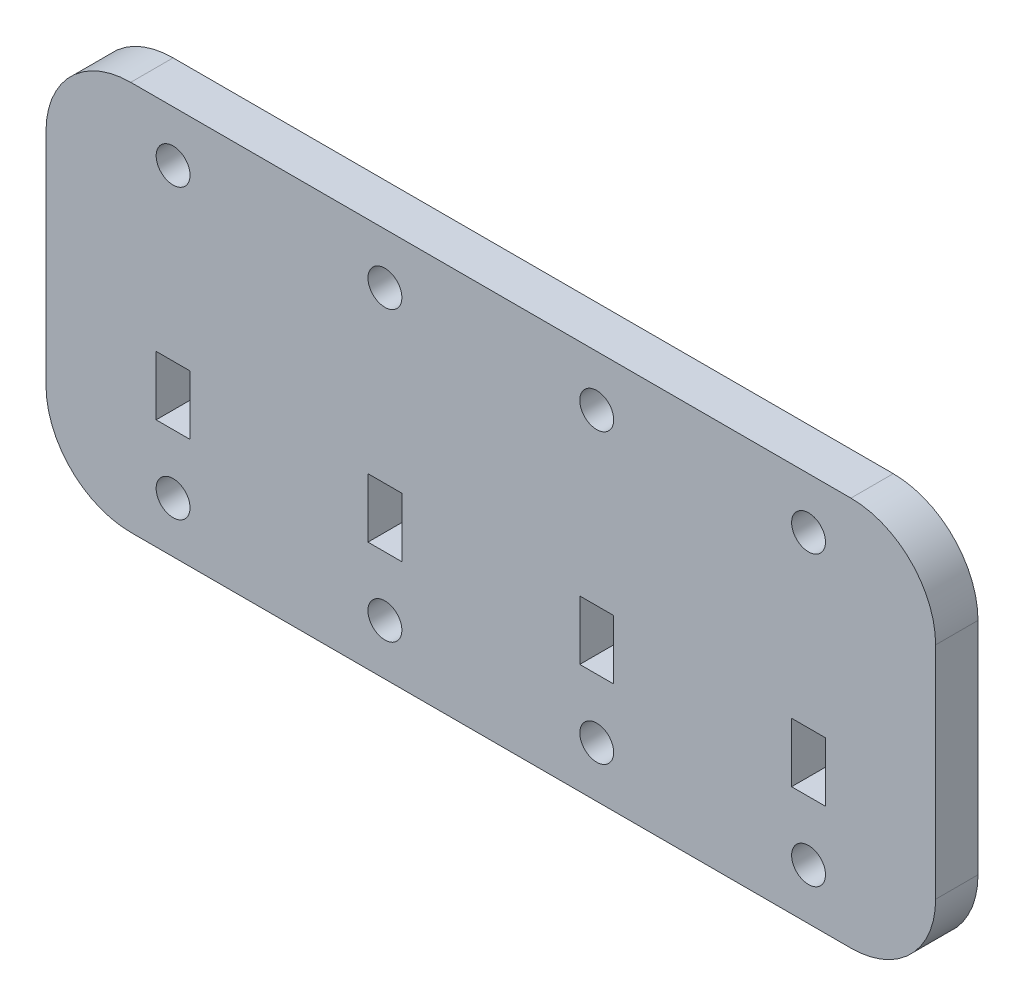
ISO-10303-21;
HEADER;
FILE_DESCRIPTION(('STEP AP214'),'2;1');
FILE_NAME('part.step','',(''),(''),'','','');
FILE_SCHEMA(('AUTOMOTIVE_DESIGN { 1 0 10303 214 1 1 1 1 }'));
ENDSEC;
DATA;
#1=APPLICATION_CONTEXT('core data for automotive mechanical design processes');
#2=APPLICATION_PROTOCOL_DEFINITION('international standard','automotive_design',2000,#1);
#3=PRODUCT_CONTEXT('',#1,'mechanical');
#4=PRODUCT('Part','Part','',(#3));
#5=PRODUCT_RELATED_PRODUCT_CATEGORY('part','',(#4));
#6=PRODUCT_DEFINITION_FORMATION('','',#4);
#7=PRODUCT_DEFINITION_CONTEXT('part definition',#1,'design');
#8=PRODUCT_DEFINITION('design','',#6,#7);
#9=PRODUCT_DEFINITION_SHAPE('','',#8);
#10=(LENGTH_UNIT() NAMED_UNIT(*) SI_UNIT(.MILLI.,.METRE.));
#11=(NAMED_UNIT(*) PLANE_ANGLE_UNIT() SI_UNIT($,.RADIAN.));
#12=(NAMED_UNIT(*) SI_UNIT($,.STERADIAN.) SOLID_ANGLE_UNIT());
#13=UNCERTAINTY_MEASURE_WITH_UNIT(LENGTH_MEASURE(1.E-05),#10,'distance_accuracy_value','');
#14=(GEOMETRIC_REPRESENTATION_CONTEXT(3) GLOBAL_UNCERTAINTY_ASSIGNED_CONTEXT((#13)) GLOBAL_UNIT_ASSIGNED_CONTEXT((#10,
#11,#12)) REPRESENTATION_CONTEXT('',''));
#15=CARTESIAN_POINT('',(0.,0.,0.));
#16=DIRECTION('',(0.,0.,1.));
#17=DIRECTION('',(1.,0.,0.));
#18=AXIS2_PLACEMENT_3D('',#15,#16,#17);
#19=CARTESIAN_POINT('',(0.,0.,5.));
#20=DIRECTION('',(0.,0.,-1.));
#21=DIRECTION('',(-1.,0.,0.));
#22=AXIS2_PLACEMENT_3D('',#19,#20,#21);
#23=PLANE('',#22);
#24=DIRECTION('',(-1.,0.,0.));
#25=VECTOR('',#24,1.);
#26=CARTESIAN_POINT('',(63.,20.,5.));
#27=LINE('',#26,#25);
#28=CARTESIAN_POINT('',(67.,20.,5.));
#29=VERTEX_POINT('',#28);
#30=CARTESIAN_POINT('',(63.,20.,5.));
#31=VERTEX_POINT('',#30);
#32=EDGE_CURVE('E459',#29,#31,#27,.T.);
#33=ORIENTED_EDGE('',*,*,#32,.F.);
#34=DIRECTION('',(0.,1.,0.));
#35=VECTOR('',#34,1.);
#36=CARTESIAN_POINT('',(67.,20.,5.));
#37=LINE('',#36,#35);
#38=CARTESIAN_POINT('',(67.,13.,5.));
#39=VERTEX_POINT('',#38);
#40=EDGE_CURVE('E472',#39,#29,#37,.T.);
#41=ORIENTED_EDGE('',*,*,#40,.F.);
#42=DIRECTION('',(1.,0.,0.));
#43=VECTOR('',#42,1.);
#44=CARTESIAN_POINT('',(63.,13.,5.));
#45=LINE('',#44,#43);
#46=CARTESIAN_POINT('',(63.,13.,5.));
#47=VERTEX_POINT('',#46);
#48=EDGE_CURVE('E477',#47,#39,#45,.T.);
#49=ORIENTED_EDGE('',*,*,#48,.F.);
#50=DIRECTION('',(0.,-1.,0.));
#51=VECTOR('',#50,1.);
#52=CARTESIAN_POINT('',(63.,20.,5.));
#53=LINE('',#52,#51);
#54=EDGE_CURVE('E463',#31,#47,#53,.T.);
#55=ORIENTED_EDGE('',*,*,#54,.F.);
#56=EDGE_LOOP('',(#33,#41,#49,#55));
#57=FACE_BOUND('',#56,.T.);
#58=DIRECTION('',(-1.,0.,0.));
#59=VECTOR('',#58,1.);
#60=CARTESIAN_POINT('',(38.,20.,5.));
#61=LINE('',#60,#59);
#62=CARTESIAN_POINT('',(42.,20.,5.));
#63=VERTEX_POINT('',#62);
#64=CARTESIAN_POINT('',(38.,20.,5.));
#65=VERTEX_POINT('',#64);
#66=EDGE_CURVE('E955',#63,#65,#61,.T.);
#67=ORIENTED_EDGE('',*,*,#66,.F.);
#68=DIRECTION('',(0.,1.,0.));
#69=VECTOR('',#68,1.);
#70=CARTESIAN_POINT('',(42.,20.,5.));
#71=LINE('',#70,#69);
#72=CARTESIAN_POINT('',(42.,13.,5.));
#73=VERTEX_POINT('',#72);
#74=EDGE_CURVE('E964',#73,#63,#71,.T.);
#75=ORIENTED_EDGE('',*,*,#74,.F.);
#76=DIRECTION('',(1.,0.,0.));
#77=VECTOR('',#76,1.);
#78=CARTESIAN_POINT('',(38.,13.,5.));
#79=LINE('',#78,#77);
#80=CARTESIAN_POINT('',(38.,13.,5.));
#81=VERTEX_POINT('',#80);
#82=EDGE_CURVE('E968',#81,#73,#79,.T.);
#83=ORIENTED_EDGE('',*,*,#82,.F.);
#84=DIRECTION('',(0.,-1.,0.));
#85=VECTOR('',#84,1.);
#86=CARTESIAN_POINT('',(38.,20.,5.));
#87=LINE('',#86,#85);
#88=EDGE_CURVE('E957',#65,#81,#87,.T.);
#89=ORIENTED_EDGE('',*,*,#88,.F.);
#90=EDGE_LOOP('',(#67,#75,#83,#89));
#91=FACE_BOUND('',#90,.T.);
#92=DIRECTION('',(0.,-1.,0.));
#93=VECTOR('',#92,1.);
#94=CARTESIAN_POINT('',(0.,0.,5.));
#95=LINE('',#94,#93);
#96=CARTESIAN_POINT('',(0.,36.,5.));
#97=VERTEX_POINT('',#96);
#98=CARTESIAN_POINT('',(0.,10.,5.));
#99=VERTEX_POINT('',#98);
#100=EDGE_CURVE('E345',#97,#99,#95,.T.);
#101=ORIENTED_EDGE('',*,*,#100,.T.);
#102=CARTESIAN_POINT('',(10.,10.,5.));
#103=DIRECTION('',(0.,0.,-1.));
#104=DIRECTION('',(-1.,0.,0.));
#105=AXIS2_PLACEMENT_3D('',#102,#103,#104);
#106=CIRCLE('',#105,10.);
#107=CARTESIAN_POINT('',(10.,0.,5.));
#108=VERTEX_POINT('',#107);
#109=EDGE_CURVE('E403',#99,#108,#106,.F.);
#110=ORIENTED_EDGE('',*,*,#109,.T.);
#111=DIRECTION('',(1.,0.,0.));
#112=VECTOR('',#111,1.);
#113=CARTESIAN_POINT('',(0.,0.,5.));
#114=LINE('',#113,#112);
#115=CARTESIAN_POINT('',(95.,0.,5.));
#116=VERTEX_POINT('',#115);
#117=EDGE_CURVE('E350',#108,#116,#114,.T.);
#118=ORIENTED_EDGE('',*,*,#117,.T.);
#119=CARTESIAN_POINT('',(95.,10.,5.));
#120=DIRECTION('',(0.,0.,-1.));
#121=DIRECTION('',(-1.,0.,0.));
#122=AXIS2_PLACEMENT_3D('',#119,#120,#121);
#123=CIRCLE('',#122,10.);
#124=CARTESIAN_POINT('',(105.,10.,5.));
#125=VERTEX_POINT('',#124);
#126=EDGE_CURVE('E400',#116,#125,#123,.F.);
#127=ORIENTED_EDGE('',*,*,#126,.T.);
#128=DIRECTION('',(0.,1.,0.));
#129=VECTOR('',#128,1.);
#130=CARTESIAN_POINT('',(105.,0.,5.));
#131=LINE('',#130,#129);
#132=CARTESIAN_POINT('',(105.,36.,5.));
#133=VERTEX_POINT('',#132);
#134=EDGE_CURVE('E361',#125,#133,#131,.T.);
#135=ORIENTED_EDGE('',*,*,#134,.T.);
#136=CARTESIAN_POINT('',(95.,36.,5.));
#137=DIRECTION('',(0.,0.,-1.));
#138=DIRECTION('',(-1.,0.,0.));
#139=AXIS2_PLACEMENT_3D('',#136,#137,#138);
#140=CIRCLE('',#139,10.);
#141=CARTESIAN_POINT('',(95.,46.,5.));
#142=VERTEX_POINT('',#141);
#143=EDGE_CURVE('E63',#133,#142,#140,.F.);
#144=ORIENTED_EDGE('',*,*,#143,.T.);
#145=DIRECTION('',(-1.,0.,0.));
#146=VECTOR('',#145,1.);
#147=CARTESIAN_POINT('',(0.,46.,5.));
#148=LINE('',#147,#146);
#149=CARTESIAN_POINT('',(10.,46.,5.));
#150=VERTEX_POINT('',#149);
#151=EDGE_CURVE('E364',#142,#150,#148,.T.);
#152=ORIENTED_EDGE('',*,*,#151,.T.);
#153=CARTESIAN_POINT('',(10.,36.,5.));
#154=DIRECTION('',(0.,0.,-1.));
#155=DIRECTION('',(-1.,0.,0.));
#156=AXIS2_PLACEMENT_3D('',#153,#154,#155);
#157=CIRCLE('',#156,10.);
#158=EDGE_CURVE('E395',#150,#97,#157,.F.);
#159=ORIENTED_EDGE('',*,*,#158,.T.);
#160=EDGE_LOOP('',(#101,#110,#118,#127,#135,#144,#152,#159));
#161=FACE_BOUND('',#160,.T.);
#162=CARTESIAN_POINT('',(15.,5.99999999999999,5.));
#163=DIRECTION('',(0.,0.,1.));
#164=DIRECTION('',(1.,0.,0.));
#165=AXIS2_PLACEMENT_3D('',#162,#163,#164);
#166=CIRCLE('',#165,2.);
#167=CARTESIAN_POINT('',(17.,5.99999999999999,5.));
#168=VERTEX_POINT('',#167);
#169=EDGE_CURVE('E337',#168,#168,#166,.T.);
#170=ORIENTED_EDGE('',*,*,#169,.F.);
#171=EDGE_LOOP('',(#170));
#172=FACE_BOUND('',#171,.T.);
#173=CARTESIAN_POINT('',(15.,40.,5.));
#174=DIRECTION('',(0.,0.,1.));
#175=DIRECTION('',(1.,0.,0.));
#176=AXIS2_PLACEMENT_3D('',#173,#174,#175);
#177=CIRCLE('',#176,2.);
#178=CARTESIAN_POINT('',(17.,40.,5.));
#179=VERTEX_POINT('',#178);
#180=EDGE_CURVE('E326',#179,#179,#177,.T.);
#181=ORIENTED_EDGE('',*,*,#180,.F.);
#182=EDGE_LOOP('',(#181));
#183=FACE_BOUND('',#182,.T.);
#184=DIRECTION('',(0.,-1.,0.));
#185=VECTOR('',#184,1.);
#186=CARTESIAN_POINT('',(13.,20.,5.));
#187=LINE('',#186,#185);
#188=CARTESIAN_POINT('',(13.,20.,5.));
#189=VERTEX_POINT('',#188);
#190=CARTESIAN_POINT('',(13.,13.,5.));
#191=VERTEX_POINT('',#190);
#192=EDGE_CURVE('E308',#189,#191,#187,.T.);
#193=ORIENTED_EDGE('',*,*,#192,.F.);
#194=DIRECTION('',(-1.,0.,0.));
#195=VECTOR('',#194,1.);
#196=CARTESIAN_POINT('',(13.,20.,5.));
#197=LINE('',#196,#195);
#198=CARTESIAN_POINT('',(17.,20.,5.));
#199=VERTEX_POINT('',#198);
#200=EDGE_CURVE('E314',#199,#189,#197,.T.);
#201=ORIENTED_EDGE('',*,*,#200,.F.);
#202=DIRECTION('',(0.,1.,0.));
#203=VECTOR('',#202,1.);
#204=CARTESIAN_POINT('',(17.,20.,5.));
#205=LINE('',#204,#203);
#206=CARTESIAN_POINT('',(17.,13.,5.));
#207=VERTEX_POINT('',#206);
#208=EDGE_CURVE('E307',#207,#199,#205,.T.);
#209=ORIENTED_EDGE('',*,*,#208,.F.);
#210=DIRECTION('',(1.,0.,0.));
#211=VECTOR('',#210,1.);
#212=CARTESIAN_POINT('',(13.,13.,5.));
#213=LINE('',#212,#211);
#214=EDGE_CURVE('E304',#191,#207,#213,.T.);
#215=ORIENTED_EDGE('',*,*,#214,.F.);
#216=EDGE_LOOP('',(#193,#201,#209,#215));
#217=FACE_BOUND('',#216,.T.);
#218=CARTESIAN_POINT('',(40.,5.99999999999999,5.));
#219=DIRECTION('',(0.,0.,1.));
#220=DIRECTION('',(1.,0.,0.));
#221=AXIS2_PLACEMENT_3D('',#218,#219,#220);
#222=CIRCLE('',#221,2.);
#223=CARTESIAN_POINT('',(42.,5.99999999999999,5.));
#224=VERTEX_POINT('',#223);
#225=EDGE_CURVE('E292',#224,#224,#222,.T.);
#226=ORIENTED_EDGE('',*,*,#225,.F.);
#227=EDGE_LOOP('',(#226));
#228=FACE_BOUND('',#227,.T.);
#229=CARTESIAN_POINT('',(40.,40.,5.));
#230=DIRECTION('',(0.,0.,1.));
#231=DIRECTION('',(1.,0.,0.));
#232=AXIS2_PLACEMENT_3D('',#229,#230,#231);
#233=CIRCLE('',#232,2.);
#234=CARTESIAN_POINT('',(42.,40.,5.));
#235=VERTEX_POINT('',#234);
#236=EDGE_CURVE('E284',#235,#235,#233,.T.);
#237=ORIENTED_EDGE('',*,*,#236,.F.);
#238=EDGE_LOOP('',(#237));
#239=FACE_BOUND('',#238,.T.);
#240=CARTESIAN_POINT('',(65.,5.99999999999999,5.));
#241=DIRECTION('',(0.,0.,1.));
#242=DIRECTION('',(1.,0.,0.));
#243=AXIS2_PLACEMENT_3D('',#240,#241,#242);
#244=CIRCLE('',#243,2.);
#245=CARTESIAN_POINT('',(67.,5.99999999999999,5.));
#246=VERTEX_POINT('',#245);
#247=EDGE_CURVE('E277',#246,#246,#244,.T.);
#248=ORIENTED_EDGE('',*,*,#247,.F.);
#249=EDGE_LOOP('',(#248));
#250=FACE_BOUND('',#249,.T.);
#251=CARTESIAN_POINT('',(65.,40.,5.));
#252=DIRECTION('',(0.,0.,1.));
#253=DIRECTION('',(1.,0.,0.));
#254=AXIS2_PLACEMENT_3D('',#251,#252,#253);
#255=CIRCLE('',#254,2.00000000000001);
#256=CARTESIAN_POINT('',(67.,40.,5.));
#257=VERTEX_POINT('',#256);
#258=EDGE_CURVE('E266',#257,#257,#255,.T.);
#259=ORIENTED_EDGE('',*,*,#258,.F.);
#260=EDGE_LOOP('',(#259));
#261=FACE_BOUND('',#260,.T.);
#262=CARTESIAN_POINT('',(90.,5.99999999999999,5.));
#263=DIRECTION('',(0.,0.,1.));
#264=DIRECTION('',(1.,0.,0.));
#265=AXIS2_PLACEMENT_3D('',#262,#263,#264);
#266=CIRCLE('',#265,2.);
#267=CARTESIAN_POINT('',(92.,5.99999999999999,5.));
#268=VERTEX_POINT('',#267);
#269=EDGE_CURVE('E258',#268,#268,#266,.T.);
#270=ORIENTED_EDGE('',*,*,#269,.F.);
#271=EDGE_LOOP('',(#270));
#272=FACE_BOUND('',#271,.T.);
#273=CARTESIAN_POINT('',(90.,40.,5.));
#274=DIRECTION('',(0.,0.,1.));
#275=DIRECTION('',(1.,0.,0.));
#276=AXIS2_PLACEMENT_3D('',#273,#274,#275);
#277=CIRCLE('',#276,2.00000000000001);
#278=CARTESIAN_POINT('',(92.,40.,5.));
#279=VERTEX_POINT('',#278);
#280=EDGE_CURVE('E247',#279,#279,#277,.T.);
#281=ORIENTED_EDGE('',*,*,#280,.F.);
#282=EDGE_LOOP('',(#281));
#283=FACE_BOUND('',#282,.T.);
#284=DIRECTION('',(-1.,0.,0.));
#285=VECTOR('',#284,1.);
#286=CARTESIAN_POINT('',(88.,20.,5.));
#287=LINE('',#286,#285);
#288=CARTESIAN_POINT('',(92.,20.,5.));
#289=VERTEX_POINT('',#288);
#290=CARTESIAN_POINT('',(88.,20.,5.));
#291=VERTEX_POINT('',#290);
#292=EDGE_CURVE('E205',#289,#291,#287,.T.);
#293=ORIENTED_EDGE('',*,*,#292,.F.);
#294=DIRECTION('',(0.,1.,0.));
#295=VECTOR('',#294,1.);
#296=CARTESIAN_POINT('',(92.,20.,5.));
#297=LINE('',#296,#295);
#298=CARTESIAN_POINT('',(92.,13.,5.));
#299=VERTEX_POINT('',#298);
#300=EDGE_CURVE('E232',#299,#289,#297,.T.);
#301=ORIENTED_EDGE('',*,*,#300,.F.);
#302=DIRECTION('',(1.,0.,0.));
#303=VECTOR('',#302,1.);
#304=CARTESIAN_POINT('',(88.,13.,5.));
#305=LINE('',#304,#303);
#306=CARTESIAN_POINT('',(88.,13.,5.));
#307=VERTEX_POINT('',#306);
#308=EDGE_CURVE('E229',#307,#299,#305,.T.);
#309=ORIENTED_EDGE('',*,*,#308,.F.);
#310=DIRECTION('',(0.,-1.,0.));
#311=VECTOR('',#310,1.);
#312=CARTESIAN_POINT('',(88.,20.,5.));
#313=LINE('',#312,#311);
#314=EDGE_CURVE('E216',#291,#307,#313,.T.);
#315=ORIENTED_EDGE('',*,*,#314,.F.);
#316=EDGE_LOOP('',(#293,#301,#309,#315));
#317=FACE_BOUND('',#316,.T.);
#318=ADVANCED_FACE('F42',(#57,#91,#161,#172,#183,#217,#228,#239,#250,#261,#272,#283,#317),#23,.F.);
#319=CARTESIAN_POINT('',(0.,0.,0.));
#320=DIRECTION('',(0.,0.,-1.));
#321=DIRECTION('',(-1.,0.,0.));
#322=AXIS2_PLACEMENT_3D('',#319,#320,#321);
#323=PLANE('',#322);
#324=CARTESIAN_POINT('',(90.,5.99999999999999,0.));
#325=DIRECTION('',(0.,0.,1.));
#326=DIRECTION('',(1.,0.,0.));
#327=AXIS2_PLACEMENT_3D('',#324,#325,#326);
#328=CIRCLE('',#327,2.);
#329=CARTESIAN_POINT('',(92.,5.99999999999999,0.));
#330=VERTEX_POINT('',#329);
#331=EDGE_CURVE('E253',#330,#330,#328,.T.);
#332=ORIENTED_EDGE('',*,*,#331,.T.);
#333=EDGE_LOOP('',(#332));
#334=FACE_BOUND('',#333,.T.);
#335=CARTESIAN_POINT('',(65.,5.99999999999999,0.));
#336=DIRECTION('',(0.,0.,1.));
#337=DIRECTION('',(1.,0.,0.));
#338=AXIS2_PLACEMENT_3D('',#335,#336,#337);
#339=CIRCLE('',#338,2.);
#340=CARTESIAN_POINT('',(67.,5.99999999999999,0.));
#341=VERTEX_POINT('',#340);
#342=EDGE_CURVE('E271',#341,#341,#339,.T.);
#343=ORIENTED_EDGE('',*,*,#342,.T.);
#344=EDGE_LOOP('',(#343));
#345=FACE_BOUND('',#344,.T.);
#346=CARTESIAN_POINT('',(40.,5.99999999999999,0.));
#347=DIRECTION('',(0.,0.,1.));
#348=DIRECTION('',(1.,0.,0.));
#349=AXIS2_PLACEMENT_3D('',#346,#347,#348);
#350=CIRCLE('',#349,2.);
#351=CARTESIAN_POINT('',(42.,5.99999999999999,0.));
#352=VERTEX_POINT('',#351);
#353=EDGE_CURVE('E289',#352,#352,#350,.T.);
#354=ORIENTED_EDGE('',*,*,#353,.T.);
#355=EDGE_LOOP('',(#354));
#356=FACE_BOUND('',#355,.T.);
#357=CARTESIAN_POINT('',(15.,5.99999999999999,0.));
#358=DIRECTION('',(0.,0.,1.));
#359=DIRECTION('',(1.,0.,0.));
#360=AXIS2_PLACEMENT_3D('',#357,#358,#359);
#361=CIRCLE('',#360,2.);
#362=CARTESIAN_POINT('',(17.,5.99999999999999,0.));
#363=VERTEX_POINT('',#362);
#364=EDGE_CURVE('E332',#363,#363,#361,.T.);
#365=ORIENTED_EDGE('',*,*,#364,.T.);
#366=EDGE_LOOP('',(#365));
#367=FACE_BOUND('',#366,.T.);
#368=DIRECTION('',(1.,0.,0.));
#369=VECTOR('',#368,1.);
#370=CARTESIAN_POINT('',(0.,0.,0.));
#371=LINE('',#370,#369);
#372=CARTESIAN_POINT('',(10.,0.,0.));
#373=VERTEX_POINT('',#372);
#374=CARTESIAN_POINT('',(95.,0.,0.));
#375=VERTEX_POINT('',#374);
#376=EDGE_CURVE('E371',#373,#375,#371,.T.);
#377=ORIENTED_EDGE('',*,*,#376,.F.);
#378=CARTESIAN_POINT('',(10.,10.,0.));
#379=DIRECTION('',(0.,0.,-1.));
#380=DIRECTION('',(-1.,0.,0.));
#381=AXIS2_PLACEMENT_3D('',#378,#379,#380);
#382=CIRCLE('',#381,10.);
#383=CARTESIAN_POINT('',(0.,10.,0.));
#384=VERTEX_POINT('',#383);
#385=EDGE_CURVE('E388',#373,#384,#382,.T.);
#386=ORIENTED_EDGE('',*,*,#385,.T.);
#387=DIRECTION('',(0.,-1.,0.));
#388=VECTOR('',#387,1.);
#389=CARTESIAN_POINT('',(0.,0.,0.));
#390=LINE('',#389,#388);
#391=CARTESIAN_POINT('',(0.,36.,0.));
#392=VERTEX_POINT('',#391);
#393=EDGE_CURVE('E342',#392,#384,#390,.T.);
#394=ORIENTED_EDGE('',*,*,#393,.F.);
#395=CARTESIAN_POINT('',(10.,36.,0.));
#396=DIRECTION('',(0.,0.,-1.));
#397=DIRECTION('',(-1.,0.,0.));
#398=AXIS2_PLACEMENT_3D('',#395,#396,#397);
#399=CIRCLE('',#398,10.);
#400=CARTESIAN_POINT('',(10.,46.,0.));
#401=VERTEX_POINT('',#400);
#402=EDGE_CURVE('E382',#392,#401,#399,.T.);
#403=ORIENTED_EDGE('',*,*,#402,.T.);
#404=DIRECTION('',(-1.,0.,0.));
#405=VECTOR('',#404,1.);
#406=CARTESIAN_POINT('',(0.,46.,0.));
#407=LINE('',#406,#405);
#408=CARTESIAN_POINT('',(95.,46.,0.));
#409=VERTEX_POINT('',#408);
#410=EDGE_CURVE('E351',#409,#401,#407,.T.);
#411=ORIENTED_EDGE('',*,*,#410,.F.);
#412=CARTESIAN_POINT('',(95.,36.,0.));
#413=DIRECTION('',(0.,0.,-1.));
#414=DIRECTION('',(-1.,0.,0.));
#415=AXIS2_PLACEMENT_3D('',#412,#413,#414);
#416=CIRCLE('',#415,10.);
#417=CARTESIAN_POINT('',(105.,36.,0.));
#418=VERTEX_POINT('',#417);
#419=EDGE_CURVE('E384',#409,#418,#416,.T.);
#420=ORIENTED_EDGE('',*,*,#419,.T.);
#421=DIRECTION('',(0.,1.,0.));
#422=VECTOR('',#421,1.);
#423=CARTESIAN_POINT('',(105.,0.,0.));
#424=LINE('',#423,#422);
#425=CARTESIAN_POINT('',(105.,10.,0.));
#426=VERTEX_POINT('',#425);
#427=EDGE_CURVE('E374',#426,#418,#424,.T.);
#428=ORIENTED_EDGE('',*,*,#427,.F.);
#429=CARTESIAN_POINT('',(95.,10.,0.));
#430=DIRECTION('',(0.,0.,-1.));
#431=DIRECTION('',(-1.,0.,0.));
#432=AXIS2_PLACEMENT_3D('',#429,#430,#431);
#433=CIRCLE('',#432,10.);
#434=EDGE_CURVE('E386',#426,#375,#433,.T.);
#435=ORIENTED_EDGE('',*,*,#434,.T.);
#436=EDGE_LOOP('',(#377,#386,#394,#403,#411,#420,#428,#435));
#437=FACE_BOUND('',#436,.T.);
#438=CARTESIAN_POINT('',(15.,40.,0.));
#439=DIRECTION('',(0.,0.,1.));
#440=DIRECTION('',(1.,0.,0.));
#441=AXIS2_PLACEMENT_3D('',#438,#439,#440);
#442=CIRCLE('',#441,2.);
#443=CARTESIAN_POINT('',(17.,40.,0.));
#444=VERTEX_POINT('',#443);
#445=EDGE_CURVE('E333',#444,#444,#442,.T.);
#446=ORIENTED_EDGE('',*,*,#445,.T.);
#447=EDGE_LOOP('',(#446));
#448=FACE_BOUND('',#447,.T.);
#449=DIRECTION('',(0.,1.,0.));
#450=VECTOR('',#449,1.);
#451=CARTESIAN_POINT('',(42.,20.,0.));
#452=LINE('',#451,#450);
#453=CARTESIAN_POINT('',(42.,13.,0.));
#454=VERTEX_POINT('',#453);
#455=CARTESIAN_POINT('',(42.,20.,0.));
#456=VERTEX_POINT('',#455);
#457=EDGE_CURVE('E958',#454,#456,#452,.T.);
#458=ORIENTED_EDGE('',*,*,#457,.T.);
#459=DIRECTION('',(-1.,0.,0.));
#460=VECTOR('',#459,1.);
#461=CARTESIAN_POINT('',(38.,20.,0.));
#462=LINE('',#461,#460);
#463=CARTESIAN_POINT('',(38.,20.,0.));
#464=VERTEX_POINT('',#463);
#465=EDGE_CURVE('E945',#456,#464,#462,.T.);
#466=ORIENTED_EDGE('',*,*,#465,.T.);
#467=DIRECTION('',(0.,-1.,0.));
#468=VECTOR('',#467,1.);
#469=CARTESIAN_POINT('',(38.,20.,0.));
#470=LINE('',#469,#468);
#471=CARTESIAN_POINT('',(38.,13.,0.));
#472=VERTEX_POINT('',#471);
#473=EDGE_CURVE('E949',#464,#472,#470,.T.);
#474=ORIENTED_EDGE('',*,*,#473,.T.);
#475=DIRECTION('',(1.,0.,0.));
#476=VECTOR('',#475,1.);
#477=CARTESIAN_POINT('',(38.,13.,0.));
#478=LINE('',#477,#476);
#479=EDGE_CURVE('E973',#472,#454,#478,.T.);
#480=ORIENTED_EDGE('',*,*,#479,.T.);
#481=EDGE_LOOP('',(#458,#466,#474,#480));
#482=FACE_BOUND('',#481,.T.);
#483=DIRECTION('',(-1.,0.,0.));
#484=VECTOR('',#483,1.);
#485=CARTESIAN_POINT('',(13.,20.,0.));
#486=LINE('',#485,#484);
#487=CARTESIAN_POINT('',(17.,20.,0.));
#488=VERTEX_POINT('',#487);
#489=CARTESIAN_POINT('',(13.,20.,0.));
#490=VERTEX_POINT('',#489);
#491=EDGE_CURVE('E447',#488,#490,#486,.T.);
#492=ORIENTED_EDGE('',*,*,#491,.T.);
#493=DIRECTION('',(0.,-1.,0.));
#494=VECTOR('',#493,1.);
#495=CARTESIAN_POINT('',(13.,20.,0.));
#496=LINE('',#495,#494);
#497=CARTESIAN_POINT('',(13.,13.,0.));
#498=VERTEX_POINT('',#497);
#499=EDGE_CURVE('E297',#490,#498,#496,.T.);
#500=ORIENTED_EDGE('',*,*,#499,.T.);
#501=DIRECTION('',(1.,0.,0.));
#502=VECTOR('',#501,1.);
#503=CARTESIAN_POINT('',(13.,13.,0.));
#504=LINE('',#503,#502);
#505=CARTESIAN_POINT('',(17.,13.,0.));
#506=VERTEX_POINT('',#505);
#507=EDGE_CURVE('E944',#498,#506,#504,.T.);
#508=ORIENTED_EDGE('',*,*,#507,.T.);
#509=DIRECTION('',(0.,1.,0.));
#510=VECTOR('',#509,1.);
#511=CARTESIAN_POINT('',(17.,20.,0.));
#512=LINE('',#511,#510);
#513=EDGE_CURVE('E1001',#506,#488,#512,.T.);
#514=ORIENTED_EDGE('',*,*,#513,.T.);
#515=EDGE_LOOP('',(#492,#500,#508,#514));
#516=FACE_BOUND('',#515,.T.);
#517=CARTESIAN_POINT('',(40.,40.,0.));
#518=DIRECTION('',(0.,0.,1.));
#519=DIRECTION('',(1.,0.,0.));
#520=AXIS2_PLACEMENT_3D('',#517,#518,#519);
#521=CIRCLE('',#520,2.);
#522=CARTESIAN_POINT('',(42.,40.,0.));
#523=VERTEX_POINT('',#522);
#524=EDGE_CURVE('E282',#523,#523,#521,.T.);
#525=ORIENTED_EDGE('',*,*,#524,.T.);
#526=EDGE_LOOP('',(#525));
#527=FACE_BOUND('',#526,.T.);
#528=CARTESIAN_POINT('',(65.,40.,0.));
#529=DIRECTION('',(0.,0.,1.));
#530=DIRECTION('',(1.,0.,0.));
#531=AXIS2_PLACEMENT_3D('',#528,#529,#530);
#532=CIRCLE('',#531,2.00000000000001);
#533=CARTESIAN_POINT('',(67.,40.,0.));
#534=VERTEX_POINT('',#533);
#535=EDGE_CURVE('E263',#534,#534,#532,.T.);
#536=ORIENTED_EDGE('',*,*,#535,.T.);
#537=EDGE_LOOP('',(#536));
#538=FACE_BOUND('',#537,.T.);
#539=CARTESIAN_POINT('',(90.,40.,0.));
#540=DIRECTION('',(0.,0.,1.));
#541=DIRECTION('',(1.,0.,0.));
#542=AXIS2_PLACEMENT_3D('',#539,#540,#541);
#543=CIRCLE('',#542,2.00000000000001);
#544=CARTESIAN_POINT('',(92.,40.,0.));
#545=VERTEX_POINT('',#544);
#546=EDGE_CURVE('E254',#545,#545,#543,.T.);
#547=ORIENTED_EDGE('',*,*,#546,.T.);
#548=EDGE_LOOP('',(#547));
#549=FACE_BOUND('',#548,.T.);
#550=DIRECTION('',(0.,1.,0.));
#551=VECTOR('',#550,1.);
#552=CARTESIAN_POINT('',(67.,20.,0.));
#553=LINE('',#552,#551);
#554=CARTESIAN_POINT('',(67.,13.,0.));
#555=VERTEX_POINT('',#554);
#556=CARTESIAN_POINT('',(67.,20.,0.));
#557=VERTEX_POINT('',#556);
#558=EDGE_CURVE('E464',#555,#557,#553,.T.);
#559=ORIENTED_EDGE('',*,*,#558,.T.);
#560=DIRECTION('',(-1.,0.,0.));
#561=VECTOR('',#560,1.);
#562=CARTESIAN_POINT('',(63.,20.,0.));
#563=LINE('',#562,#561);
#564=CARTESIAN_POINT('',(63.,20.,0.));
#565=VERTEX_POINT('',#564);
#566=EDGE_CURVE('E224',#557,#565,#563,.T.);
#567=ORIENTED_EDGE('',*,*,#566,.T.);
#568=DIRECTION('',(0.,-1.,0.));
#569=VECTOR('',#568,1.);
#570=CARTESIAN_POINT('',(63.,20.,0.));
#571=LINE('',#570,#569);
#572=CARTESIAN_POINT('',(63.,13.,0.));
#573=VERTEX_POINT('',#572);
#574=EDGE_CURVE('E481',#565,#573,#571,.T.);
#575=ORIENTED_EDGE('',*,*,#574,.T.);
#576=DIRECTION('',(1.,0.,0.));
#577=VECTOR('',#576,1.);
#578=CARTESIAN_POINT('',(63.,13.,0.));
#579=LINE('',#578,#577);
#580=EDGE_CURVE('E484',#573,#555,#579,.T.);
#581=ORIENTED_EDGE('',*,*,#580,.T.);
#582=EDGE_LOOP('',(#559,#567,#575,#581));
#583=FACE_BOUND('',#582,.T.);
#584=DIRECTION('',(0.,1.,0.));
#585=VECTOR('',#584,1.);
#586=CARTESIAN_POINT('',(92.,20.,0.));
#587=LINE('',#586,#585);
#588=CARTESIAN_POINT('',(92.,13.,0.));
#589=VERTEX_POINT('',#588);
#590=CARTESIAN_POINT('',(92.,20.,0.));
#591=VERTEX_POINT('',#590);
#592=EDGE_CURVE('E217',#589,#591,#587,.T.);
#593=ORIENTED_EDGE('',*,*,#592,.T.);
#594=DIRECTION('',(-1.,0.,0.));
#595=VECTOR('',#594,1.);
#596=CARTESIAN_POINT('',(88.,20.,0.));
#597=LINE('',#596,#595);
#598=CARTESIAN_POINT('',(88.,20.,0.));
#599=VERTEX_POINT('',#598);
#600=EDGE_CURVE('E1010',#591,#599,#597,.T.);
#601=ORIENTED_EDGE('',*,*,#600,.T.);
#602=DIRECTION('',(0.,-1.,0.));
#603=VECTOR('',#602,1.);
#604=CARTESIAN_POINT('',(88.,20.,0.));
#605=LINE('',#604,#603);
#606=CARTESIAN_POINT('',(88.,13.,0.));
#607=VERTEX_POINT('',#606);
#608=EDGE_CURVE('E223',#599,#607,#605,.T.);
#609=ORIENTED_EDGE('',*,*,#608,.T.);
#610=DIRECTION('',(1.,0.,0.));
#611=VECTOR('',#610,1.);
#612=CARTESIAN_POINT('',(88.,13.,0.));
#613=LINE('',#612,#611);
#614=EDGE_CURVE('E1009',#607,#589,#613,.T.);
#615=ORIENTED_EDGE('',*,*,#614,.T.);
#616=EDGE_LOOP('',(#593,#601,#609,#615));
#617=FACE_BOUND('',#616,.T.);
#618=ADVANCED_FACE('F420',(#334,#345,#356,#367,#437,#448,#482,#516,#527,#538,#549,#583,#617),
#323,.T.);
#619=CARTESIAN_POINT('',(0.,0.,5.));
#620=DIRECTION('',(1.,0.,0.));
#621=DIRECTION('',(0.,0.,-1.));
#622=AXIS2_PLACEMENT_3D('',#619,#620,#621);
#623=PLANE('',#622);
#624=ORIENTED_EDGE('',*,*,#393,.T.);
#625=DIRECTION('',(0.,0.,-1.));
#626=VECTOR('',#625,1.);
#627=CARTESIAN_POINT('',(0.,10.,5.));
#628=LINE('',#627,#626);
#629=EDGE_CURVE('E393',#384,#99,#628,.F.);
#630=ORIENTED_EDGE('',*,*,#629,.T.);
#631=ORIENTED_EDGE('',*,*,#100,.F.);
#632=DIRECTION('',(0.,0.,-1.));
#633=VECTOR('',#632,1.);
#634=CARTESIAN_POINT('',(0.,36.,5.));
#635=LINE('',#634,#633);
#636=EDGE_CURVE('E390',#97,#392,#635,.T.);
#637=ORIENTED_EDGE('',*,*,#636,.T.);
#638=EDGE_LOOP('',(#624,#630,#631,#637));
#639=FACE_BOUND('',#638,.T.);
#640=ADVANCED_FACE('F434',(#639),#623,.F.);
#641=CARTESIAN_POINT('',(0.,0.,5.));
#642=DIRECTION('',(0.,1.,0.));
#643=DIRECTION('',(0.,0.,1.));
#644=AXIS2_PLACEMENT_3D('',#641,#642,#643);
#645=PLANE('',#644);
#646=ORIENTED_EDGE('',*,*,#117,.F.);
#647=DIRECTION('',(0.,0.,-1.));
#648=VECTOR('',#647,1.);
#649=CARTESIAN_POINT('',(10.,0.,5.));
#650=LINE('',#649,#648);
#651=EDGE_CURVE('E379',#108,#373,#650,.T.);
#652=ORIENTED_EDGE('',*,*,#651,.T.);
#653=ORIENTED_EDGE('',*,*,#376,.T.);
#654=DIRECTION('',(0.,0.,-1.));
#655=VECTOR('',#654,1.);
#656=CARTESIAN_POINT('',(95.,0.,5.));
#657=LINE('',#656,#655);
#658=EDGE_CURVE('E368',#375,#116,#657,.F.);
#659=ORIENTED_EDGE('',*,*,#658,.T.);
#660=EDGE_LOOP('',(#646,#652,#653,#659));
#661=FACE_BOUND('',#660,.T.);
#662=ADVANCED_FACE('F442',(#661),#645,.F.);
#663=CARTESIAN_POINT('',(105.,0.,5.));
#664=DIRECTION('',(-1.,0.,0.));
#665=DIRECTION('',(0.,0.,1.));
#666=AXIS2_PLACEMENT_3D('',#663,#664,#665);
#667=PLANE('',#666);
#668=ORIENTED_EDGE('',*,*,#134,.F.);
#669=DIRECTION('',(0.,0.,-1.));
#670=VECTOR('',#669,1.);
#671=CARTESIAN_POINT('',(105.,10.,5.));
#672=LINE('',#671,#670);
#673=EDGE_CURVE('E408',#125,#426,#672,.T.);
#674=ORIENTED_EDGE('',*,*,#673,.T.);
#675=ORIENTED_EDGE('',*,*,#427,.T.);
#676=DIRECTION('',(0.,0.,-1.));
#677=VECTOR('',#676,1.);
#678=CARTESIAN_POINT('',(105.,36.,5.));
#679=LINE('',#678,#677);
#680=EDGE_CURVE('E406',#418,#133,#679,.F.);
#681=ORIENTED_EDGE('',*,*,#680,.T.);
#682=EDGE_LOOP('',(#668,#674,#675,#681));
#683=FACE_BOUND('',#682,.T.);
#684=ADVANCED_FACE('F414',(#683),#667,.F.);
#685=CARTESIAN_POINT('',(0.,46.,5.));
#686=DIRECTION('',(0.,-1.,0.));
#687=DIRECTION('',(0.,0.,-1.));
#688=AXIS2_PLACEMENT_3D('',#685,#686,#687);
#689=PLANE('',#688);
#690=ORIENTED_EDGE('',*,*,#151,.F.);
#691=DIRECTION('',(0.,0.,-1.));
#692=VECTOR('',#691,1.);
#693=CARTESIAN_POINT('',(95.,46.,5.));
#694=LINE('',#693,#692);
#695=EDGE_CURVE('E12',#142,#409,#694,.T.);
#696=ORIENTED_EDGE('',*,*,#695,.T.);
#697=ORIENTED_EDGE('',*,*,#410,.T.);
#698=DIRECTION('',(0.,0.,-1.));
#699=VECTOR('',#698,1.);
#700=CARTESIAN_POINT('',(10.,46.,5.));
#701=LINE('',#700,#699);
#702=EDGE_CURVE('E50',#401,#150,#701,.F.);
#703=ORIENTED_EDGE('',*,*,#702,.T.);
#704=EDGE_LOOP('',(#690,#696,#697,#703));
#705=FACE_BOUND('',#704,.T.);
#706=ADVANCED_FACE('F426',(#705),#689,.F.);
#707=CARTESIAN_POINT('',(15.,5.99999999999999,5.));
#708=DIRECTION('',(0.,0.,-1.));
#709=DIRECTION('',(-1.,0.,0.));
#710=AXIS2_PLACEMENT_3D('',#707,#708,#709);
#711=CYLINDRICAL_SURFACE('',#710,2.);
#712=ORIENTED_EDGE('',*,*,#169,.T.);
#713=EDGE_LOOP('',(#712));
#714=FACE_BOUND('',#713,.T.);
#715=ORIENTED_EDGE('',*,*,#364,.F.);
#716=EDGE_LOOP('',(#715));
#717=FACE_BOUND('',#716,.T.);
#718=ADVANCED_FACE('F535',(#714,#717),#711,.F.);
#719=CARTESIAN_POINT('',(15.,40.,5.));
#720=DIRECTION('',(0.,0.,-1.));
#721=DIRECTION('',(-1.,0.,0.));
#722=AXIS2_PLACEMENT_3D('',#719,#720,#721);
#723=CYLINDRICAL_SURFACE('',#722,2.);
#724=ORIENTED_EDGE('',*,*,#180,.T.);
#725=EDGE_LOOP('',(#724));
#726=FACE_BOUND('',#725,.T.);
#727=ORIENTED_EDGE('',*,*,#445,.F.);
#728=EDGE_LOOP('',(#727));
#729=FACE_BOUND('',#728,.T.);
#730=ADVANCED_FACE('F838',(#726,#729),#723,.F.);
#731=CARTESIAN_POINT('',(38.,20.,5.));
#732=DIRECTION('',(0.,-1.,0.));
#733=DIRECTION('',(0.,0.,-1.));
#734=AXIS2_PLACEMENT_3D('',#731,#732,#733);
#735=PLANE('',#734);
#736=ORIENTED_EDGE('',*,*,#465,.F.);
#737=DIRECTION('',(0.,0.,-1.));
#738=VECTOR('',#737,1.);
#739=CARTESIAN_POINT('',(42.,20.,5.));
#740=LINE('',#739,#738);
#741=EDGE_CURVE('E967',#63,#456,#740,.T.);
#742=ORIENTED_EDGE('',*,*,#741,.F.);
#743=ORIENTED_EDGE('',*,*,#66,.T.);
#744=DIRECTION('',(0.,0.,-1.));
#745=VECTOR('',#744,1.);
#746=CARTESIAN_POINT('',(38.,20.,5.));
#747=LINE('',#746,#745);
#748=EDGE_CURVE('E334',#65,#464,#747,.T.);
#749=ORIENTED_EDGE('',*,*,#748,.T.);
#750=EDGE_LOOP('',(#736,#742,#743,#749));
#751=FACE_BOUND('',#750,.T.);
#752=ADVANCED_FACE('F827',(#751),#735,.T.);
#753=CARTESIAN_POINT('',(38.,20.,5.));
#754=DIRECTION('',(1.,0.,0.));
#755=DIRECTION('',(0.,0.,-1.));
#756=AXIS2_PLACEMENT_3D('',#753,#754,#755);
#757=PLANE('',#756);
#758=ORIENTED_EDGE('',*,*,#473,.F.);
#759=ORIENTED_EDGE('',*,*,#748,.F.);
#760=ORIENTED_EDGE('',*,*,#88,.T.);
#761=DIRECTION('',(0.,0.,-1.));
#762=VECTOR('',#761,1.);
#763=CARTESIAN_POINT('',(38.,13.,5.));
#764=LINE('',#763,#762);
#765=EDGE_CURVE('E981',#81,#472,#764,.T.);
#766=ORIENTED_EDGE('',*,*,#765,.T.);
#767=EDGE_LOOP('',(#758,#759,#760,#766));
#768=FACE_BOUND('',#767,.T.);
#769=ADVANCED_FACE('F816',(#768),#757,.T.);
#770=CARTESIAN_POINT('',(38.,13.,5.));
#771=DIRECTION('',(0.,1.,0.));
#772=DIRECTION('',(0.,0.,1.));
#773=AXIS2_PLACEMENT_3D('',#770,#771,#772);
#774=PLANE('',#773);
#775=ORIENTED_EDGE('',*,*,#479,.F.);
#776=ORIENTED_EDGE('',*,*,#765,.F.);
#777=ORIENTED_EDGE('',*,*,#82,.T.);
#778=DIRECTION('',(0.,0.,-1.));
#779=VECTOR('',#778,1.);
#780=CARTESIAN_POINT('',(42.,13.,5.));
#781=LINE('',#780,#779);
#782=EDGE_CURVE('E980',#73,#454,#781,.T.);
#783=ORIENTED_EDGE('',*,*,#782,.T.);
#784=EDGE_LOOP('',(#775,#776,#777,#783));
#785=FACE_BOUND('',#784,.T.);
#786=ADVANCED_FACE('F805',(#785),#774,.T.);
#787=CARTESIAN_POINT('',(42.,20.,5.));
#788=DIRECTION('',(-1.,0.,0.));
#789=DIRECTION('',(0.,0.,1.));
#790=AXIS2_PLACEMENT_3D('',#787,#788,#789);
#791=PLANE('',#790);
#792=ORIENTED_EDGE('',*,*,#457,.F.);
#793=ORIENTED_EDGE('',*,*,#782,.F.);
#794=ORIENTED_EDGE('',*,*,#74,.T.);
#795=ORIENTED_EDGE('',*,*,#741,.T.);
#796=EDGE_LOOP('',(#792,#793,#794,#795));
#797=FACE_BOUND('',#796,.T.);
#798=ADVANCED_FACE('F794',(#797),#791,.T.);
#799=CARTESIAN_POINT('',(13.,20.,5.));
#800=DIRECTION('',(1.,0.,0.));
#801=DIRECTION('',(0.,0.,-1.));
#802=AXIS2_PLACEMENT_3D('',#799,#800,#801);
#803=PLANE('',#802);
#804=ORIENTED_EDGE('',*,*,#499,.F.);
#805=DIRECTION('',(0.,0.,-1.));
#806=VECTOR('',#805,1.);
#807=CARTESIAN_POINT('',(13.,20.,5.));
#808=LINE('',#807,#806);
#809=EDGE_CURVE('E318',#189,#490,#808,.T.);
#810=ORIENTED_EDGE('',*,*,#809,.F.);
#811=ORIENTED_EDGE('',*,*,#192,.T.);
#812=DIRECTION('',(0.,0.,-1.));
#813=VECTOR('',#812,1.);
#814=CARTESIAN_POINT('',(13.,13.,5.));
#815=LINE('',#814,#813);
#816=EDGE_CURVE('E939',#191,#498,#815,.T.);
#817=ORIENTED_EDGE('',*,*,#816,.T.);
#818=EDGE_LOOP('',(#804,#810,#811,#817));
#819=FACE_BOUND('',#818,.T.);
#820=ADVANCED_FACE('F783',(#819),#803,.T.);
#821=CARTESIAN_POINT('',(13.,13.,5.));
#822=DIRECTION('',(0.,1.,0.));
#823=DIRECTION('',(0.,0.,1.));
#824=AXIS2_PLACEMENT_3D('',#821,#822,#823);
#825=PLANE('',#824);
#826=ORIENTED_EDGE('',*,*,#507,.F.);
#827=ORIENTED_EDGE('',*,*,#816,.F.);
#828=ORIENTED_EDGE('',*,*,#214,.T.);
#829=DIRECTION('',(0.,0.,-1.));
#830=VECTOR('',#829,1.);
#831=CARTESIAN_POINT('',(17.,13.,5.));
#832=LINE('',#831,#830);
#833=EDGE_CURVE('E946',#207,#506,#832,.T.);
#834=ORIENTED_EDGE('',*,*,#833,.T.);
#835=EDGE_LOOP('',(#826,#827,#828,#834));
#836=FACE_BOUND('',#835,.T.);
#837=ADVANCED_FACE('F772',(#836),#825,.T.);
#838=CARTESIAN_POINT('',(17.,20.,5.));
#839=DIRECTION('',(-1.,0.,0.));
#840=DIRECTION('',(0.,-1.,0.));
#841=AXIS2_PLACEMENT_3D('',#838,#839,#840);
#842=PLANE('',#841);
#843=ORIENTED_EDGE('',*,*,#513,.F.);
#844=ORIENTED_EDGE('',*,*,#833,.F.);
#845=ORIENTED_EDGE('',*,*,#208,.T.);
#846=DIRECTION('',(0.,0.,-1.));
#847=VECTOR('',#846,1.);
#848=CARTESIAN_POINT('',(17.,20.,5.));
#849=LINE('',#848,#847);
#850=EDGE_CURVE('E951',#199,#488,#849,.T.);
#851=ORIENTED_EDGE('',*,*,#850,.T.);
#852=EDGE_LOOP('',(#843,#844,#845,#851));
#853=FACE_BOUND('',#852,.T.);
#854=ADVANCED_FACE('F761',(#853),#842,.T.);
#855=CARTESIAN_POINT('',(13.,20.,5.));
#856=DIRECTION('',(0.,-1.,0.));
#857=DIRECTION('',(0.,0.,-1.));
#858=AXIS2_PLACEMENT_3D('',#855,#856,#857);
#859=PLANE('',#858);
#860=ORIENTED_EDGE('',*,*,#491,.F.);
#861=ORIENTED_EDGE('',*,*,#850,.F.);
#862=ORIENTED_EDGE('',*,*,#200,.T.);
#863=ORIENTED_EDGE('',*,*,#809,.T.);
#864=EDGE_LOOP('',(#860,#861,#862,#863));
#865=FACE_BOUND('',#864,.T.);
#866=ADVANCED_FACE('F750',(#865),#859,.T.);
#867=CARTESIAN_POINT('',(40.,5.99999999999999,5.));
#868=DIRECTION('',(0.,0.,-1.));
#869=DIRECTION('',(-1.,0.,0.));
#870=AXIS2_PLACEMENT_3D('',#867,#868,#869);
#871=CYLINDRICAL_SURFACE('',#870,2.);
#872=ORIENTED_EDGE('',*,*,#225,.T.);
#873=EDGE_LOOP('',(#872));
#874=FACE_BOUND('',#873,.T.);
#875=ORIENTED_EDGE('',*,*,#353,.F.);
#876=EDGE_LOOP('',(#875));
#877=FACE_BOUND('',#876,.T.);
#878=ADVANCED_FACE('F739',(#874,#877),#871,.F.);
#879=CARTESIAN_POINT('',(40.,40.,5.));
#880=DIRECTION('',(0.,0.,-1.));
#881=DIRECTION('',(-1.,0.,0.));
#882=AXIS2_PLACEMENT_3D('',#879,#880,#881);
#883=CYLINDRICAL_SURFACE('',#882,2.);
#884=ORIENTED_EDGE('',*,*,#236,.T.);
#885=EDGE_LOOP('',(#884));
#886=FACE_BOUND('',#885,.T.);
#887=ORIENTED_EDGE('',*,*,#524,.F.);
#888=EDGE_LOOP('',(#887));
#889=FACE_BOUND('',#888,.T.);
#890=ADVANCED_FACE('F728',(#886,#889),#883,.F.);
#891=CARTESIAN_POINT('',(65.,5.99999999999999,5.));
#892=DIRECTION('',(0.,0.,-1.));
#893=DIRECTION('',(-1.,0.,0.));
#894=AXIS2_PLACEMENT_3D('',#891,#892,#893);
#895=CYLINDRICAL_SURFACE('',#894,2.);
#896=ORIENTED_EDGE('',*,*,#247,.T.);
#897=EDGE_LOOP('',(#896));
#898=FACE_BOUND('',#897,.T.);
#899=ORIENTED_EDGE('',*,*,#342,.F.);
#900=EDGE_LOOP('',(#899));
#901=FACE_BOUND('',#900,.T.);
#902=ADVANCED_FACE('F717',(#898,#901),#895,.F.);
#903=CARTESIAN_POINT('',(65.,40.,5.));
#904=DIRECTION('',(0.,0.,-1.));
#905=DIRECTION('',(-1.,0.,0.));
#906=AXIS2_PLACEMENT_3D('',#903,#904,#905);
#907=CYLINDRICAL_SURFACE('',#906,2.00000000000001);
#908=ORIENTED_EDGE('',*,*,#258,.T.);
#909=EDGE_LOOP('',(#908));
#910=FACE_BOUND('',#909,.T.);
#911=ORIENTED_EDGE('',*,*,#535,.F.);
#912=EDGE_LOOP('',(#911));
#913=FACE_BOUND('',#912,.T.);
#914=ADVANCED_FACE('F706',(#910,#913),#907,.F.);
#915=CARTESIAN_POINT('',(90.,5.99999999999999,5.));
#916=DIRECTION('',(0.,0.,-1.));
#917=DIRECTION('',(-1.,0.,0.));
#918=AXIS2_PLACEMENT_3D('',#915,#916,#917);
#919=CYLINDRICAL_SURFACE('',#918,2.);
#920=ORIENTED_EDGE('',*,*,#269,.T.);
#921=EDGE_LOOP('',(#920));
#922=FACE_BOUND('',#921,.T.);
#923=ORIENTED_EDGE('',*,*,#331,.F.);
#924=EDGE_LOOP('',(#923));
#925=FACE_BOUND('',#924,.T.);
#926=ADVANCED_FACE('F695',(#922,#925),#919,.F.);
#927=CARTESIAN_POINT('',(90.,40.,5.));
#928=DIRECTION('',(0.,0.,-1.));
#929=DIRECTION('',(-1.,0.,0.));
#930=AXIS2_PLACEMENT_3D('',#927,#928,#929);
#931=CYLINDRICAL_SURFACE('',#930,2.00000000000001);
#932=ORIENTED_EDGE('',*,*,#280,.T.);
#933=EDGE_LOOP('',(#932));
#934=FACE_BOUND('',#933,.T.);
#935=ORIENTED_EDGE('',*,*,#546,.F.);
#936=EDGE_LOOP('',(#935));
#937=FACE_BOUND('',#936,.T.);
#938=ADVANCED_FACE('F685',(#934,#937),#931,.F.);
#939=CARTESIAN_POINT('',(63.,20.,5.));
#940=DIRECTION('',(0.,-1.,0.));
#941=DIRECTION('',(0.,0.,-1.));
#942=AXIS2_PLACEMENT_3D('',#939,#940,#941);
#943=PLANE('',#942);
#944=ORIENTED_EDGE('',*,*,#566,.F.);
#945=DIRECTION('',(0.,0.,-1.));
#946=VECTOR('',#945,1.);
#947=CARTESIAN_POINT('',(67.,20.,5.));
#948=LINE('',#947,#946);
#949=EDGE_CURVE('E476',#29,#557,#948,.T.);
#950=ORIENTED_EDGE('',*,*,#949,.F.);
#951=ORIENTED_EDGE('',*,*,#32,.T.);
#952=DIRECTION('',(0.,0.,-1.));
#953=VECTOR('',#952,1.);
#954=CARTESIAN_POINT('',(63.,20.,5.));
#955=LINE('',#954,#953);
#956=EDGE_CURVE('E255',#31,#565,#955,.T.);
#957=ORIENTED_EDGE('',*,*,#956,.T.);
#958=EDGE_LOOP('',(#944,#950,#951,#957));
#959=FACE_BOUND('',#958,.T.);
#960=ADVANCED_FACE('F499',(#959),#943,.T.);
#961=CARTESIAN_POINT('',(63.,20.,5.));
#962=DIRECTION('',(1.,0.,0.));
#963=DIRECTION('',(0.,0.,-1.));
#964=AXIS2_PLACEMENT_3D('',#961,#962,#963);
#965=PLANE('',#964);
#966=ORIENTED_EDGE('',*,*,#574,.F.);
#967=ORIENTED_EDGE('',*,*,#956,.F.);
#968=ORIENTED_EDGE('',*,*,#54,.T.);
#969=DIRECTION('',(0.,0.,-1.));
#970=VECTOR('',#969,1.);
#971=CARTESIAN_POINT('',(63.,13.,5.));
#972=LINE('',#971,#970);
#973=EDGE_CURVE('E492',#47,#573,#972,.T.);
#974=ORIENTED_EDGE('',*,*,#973,.T.);
#975=EDGE_LOOP('',(#966,#967,#968,#974));
#976=FACE_BOUND('',#975,.T.);
#977=ADVANCED_FACE('F519',(#976),#965,.T.);
#978=CARTESIAN_POINT('',(63.,13.,5.));
#979=DIRECTION('',(0.,1.,0.));
#980=DIRECTION('',(0.,0.,1.));
#981=AXIS2_PLACEMENT_3D('',#978,#979,#980);
#982=PLANE('',#981);
#983=ORIENTED_EDGE('',*,*,#580,.F.);
#984=ORIENTED_EDGE('',*,*,#973,.F.);
#985=ORIENTED_EDGE('',*,*,#48,.T.);
#986=DIRECTION('',(0.,0.,-1.));
#987=VECTOR('',#986,1.);
#988=CARTESIAN_POINT('',(67.,13.,5.));
#989=LINE('',#988,#987);
#990=EDGE_CURVE('E491',#39,#555,#989,.T.);
#991=ORIENTED_EDGE('',*,*,#990,.T.);
#992=EDGE_LOOP('',(#983,#984,#985,#991));
#993=FACE_BOUND('',#992,.T.);
#994=ADVANCED_FACE('F517',(#993),#982,.T.);
#995=CARTESIAN_POINT('',(67.,20.,5.));
#996=DIRECTION('',(-1.,0.,0.));
#997=DIRECTION('',(0.,0.,1.));
#998=AXIS2_PLACEMENT_3D('',#995,#996,#997);
#999=PLANE('',#998);
#1000=ORIENTED_EDGE('',*,*,#558,.F.);
#1001=ORIENTED_EDGE('',*,*,#990,.F.);
#1002=ORIENTED_EDGE('',*,*,#40,.T.);
#1003=ORIENTED_EDGE('',*,*,#949,.T.);
#1004=EDGE_LOOP('',(#1000,#1001,#1002,#1003));
#1005=FACE_BOUND('',#1004,.T.);
#1006=ADVANCED_FACE('F507',(#1005),#999,.T.);
#1007=CARTESIAN_POINT('',(88.,20.,5.));
#1008=DIRECTION('',(0.,-1.,0.));
#1009=DIRECTION('',(0.,0.,-1.));
#1010=AXIS2_PLACEMENT_3D('',#1007,#1008,#1009);
#1011=PLANE('',#1010);
#1012=ORIENTED_EDGE('',*,*,#600,.F.);
#1013=DIRECTION('',(0.,0.,-1.));
#1014=VECTOR('',#1013,1.);
#1015=CARTESIAN_POINT('',(92.,20.,5.));
#1016=LINE('',#1015,#1014);
#1017=EDGE_CURVE('E211',#289,#591,#1016,.T.);
#1018=ORIENTED_EDGE('',*,*,#1017,.F.);
#1019=ORIENTED_EDGE('',*,*,#292,.T.);
#1020=DIRECTION('',(0.,0.,-1.));
#1021=VECTOR('',#1020,1.);
#1022=CARTESIAN_POINT('',(88.,20.,5.));
#1023=LINE('',#1022,#1021);
#1024=EDGE_CURVE('E208',#291,#599,#1023,.T.);
#1025=ORIENTED_EDGE('',*,*,#1024,.T.);
#1026=EDGE_LOOP('',(#1012,#1018,#1019,#1025));
#1027=FACE_BOUND('',#1026,.T.);
#1028=ADVANCED_FACE('F207',(#1027),#1011,.T.);
#1029=CARTESIAN_POINT('',(88.,20.,5.));
#1030=DIRECTION('',(1.,0.,0.));
#1031=DIRECTION('',(0.,0.,-1.));
#1032=AXIS2_PLACEMENT_3D('',#1029,#1030,#1031);
#1033=PLANE('',#1032);
#1034=ORIENTED_EDGE('',*,*,#608,.F.);
#1035=ORIENTED_EDGE('',*,*,#1024,.F.);
#1036=ORIENTED_EDGE('',*,*,#314,.T.);
#1037=DIRECTION('',(0.,0.,-1.));
#1038=VECTOR('',#1037,1.);
#1039=CARTESIAN_POINT('',(88.,13.,5.));
#1040=LINE('',#1039,#1038);
#1041=EDGE_CURVE('E225',#307,#607,#1040,.T.);
#1042=ORIENTED_EDGE('',*,*,#1041,.T.);
#1043=EDGE_LOOP('',(#1034,#1035,#1036,#1042));
#1044=FACE_BOUND('',#1043,.T.);
#1045=ADVANCED_FACE('F220',(#1044),#1033,.T.);
#1046=CARTESIAN_POINT('',(88.,13.,5.));
#1047=DIRECTION('',(0.,1.,0.));
#1048=DIRECTION('',(0.,0.,1.));
#1049=AXIS2_PLACEMENT_3D('',#1046,#1047,#1048);
#1050=PLANE('',#1049);
#1051=ORIENTED_EDGE('',*,*,#614,.F.);
#1052=ORIENTED_EDGE('',*,*,#1041,.F.);
#1053=ORIENTED_EDGE('',*,*,#308,.T.);
#1054=DIRECTION('',(0.,0.,-1.));
#1055=VECTOR('',#1054,1.);
#1056=CARTESIAN_POINT('',(92.,13.,5.));
#1057=LINE('',#1056,#1055);
#1058=EDGE_CURVE('E450',#299,#589,#1057,.T.);
#1059=ORIENTED_EDGE('',*,*,#1058,.T.);
#1060=EDGE_LOOP('',(#1051,#1052,#1053,#1059));
#1061=FACE_BOUND('',#1060,.T.);
#1062=ADVANCED_FACE('F628',(#1061),#1050,.T.);
#1063=CARTESIAN_POINT('',(92.,20.,5.));
#1064=DIRECTION('',(-1.,0.,0.));
#1065=DIRECTION('',(0.,-1.,0.));
#1066=AXIS2_PLACEMENT_3D('',#1063,#1064,#1065);
#1067=PLANE('',#1066);
#1068=ORIENTED_EDGE('',*,*,#592,.F.);
#1069=ORIENTED_EDGE('',*,*,#1058,.F.);
#1070=ORIENTED_EDGE('',*,*,#300,.T.);
#1071=ORIENTED_EDGE('',*,*,#1017,.T.);
#1072=EDGE_LOOP('',(#1068,#1069,#1070,#1071));
#1073=FACE_BOUND('',#1072,.T.);
#1074=ADVANCED_FACE('F549',(#1073),#1067,.T.);
#1075=CARTESIAN_POINT('',(10.,10.,5.));
#1076=DIRECTION('',(0.,0.,-1.));
#1077=DIRECTION('',(-1.,0.,0.));
#1078=AXIS2_PLACEMENT_3D('',#1075,#1076,#1077);
#1079=CYLINDRICAL_SURFACE('',#1078,10.);
#1080=ORIENTED_EDGE('',*,*,#109,.F.);
#1081=ORIENTED_EDGE('',*,*,#629,.F.);
#1082=ORIENTED_EDGE('',*,*,#385,.F.);
#1083=ORIENTED_EDGE('',*,*,#651,.F.);
#1084=EDGE_LOOP('',(#1080,#1081,#1082,#1083));
#1085=FACE_BOUND('',#1084,.T.);
#1086=ADVANCED_FACE('F439',(#1085),#1079,.T.);
#1087=CARTESIAN_POINT('',(95.,10.,5.));
#1088=DIRECTION('',(0.,0.,-1.));
#1089=DIRECTION('',(-1.,0.,0.));
#1090=AXIS2_PLACEMENT_3D('',#1087,#1088,#1089);
#1091=CYLINDRICAL_SURFACE('',#1090,10.);
#1092=ORIENTED_EDGE('',*,*,#126,.F.);
#1093=ORIENTED_EDGE('',*,*,#658,.F.);
#1094=ORIENTED_EDGE('',*,*,#434,.F.);
#1095=ORIENTED_EDGE('',*,*,#673,.F.);
#1096=EDGE_LOOP('',(#1092,#1093,#1094,#1095));
#1097=FACE_BOUND('',#1096,.T.);
#1098=ADVANCED_FACE('F548',(#1097),#1091,.T.);
#1099=CARTESIAN_POINT('',(95.,36.,5.));
#1100=DIRECTION('',(0.,0.,-1.));
#1101=DIRECTION('',(-1.,0.,0.));
#1102=AXIS2_PLACEMENT_3D('',#1099,#1100,#1101);
#1103=CYLINDRICAL_SURFACE('',#1102,10.);
#1104=ORIENTED_EDGE('',*,*,#143,.F.);
#1105=ORIENTED_EDGE('',*,*,#680,.F.);
#1106=ORIENTED_EDGE('',*,*,#419,.F.);
#1107=ORIENTED_EDGE('',*,*,#695,.F.);
#1108=EDGE_LOOP('',(#1104,#1105,#1106,#1107));
#1109=FACE_BOUND('',#1108,.T.);
#1110=ADVANCED_FACE('F425',(#1109),#1103,.T.);
#1111=CARTESIAN_POINT('',(10.,36.,5.));
#1112=DIRECTION('',(0.,0.,-1.));
#1113=DIRECTION('',(-1.,0.,0.));
#1114=AXIS2_PLACEMENT_3D('',#1111,#1112,#1113);
#1115=CYLINDRICAL_SURFACE('',#1114,10.);
#1116=ORIENTED_EDGE('',*,*,#158,.F.);
#1117=ORIENTED_EDGE('',*,*,#702,.F.);
#1118=ORIENTED_EDGE('',*,*,#402,.F.);
#1119=ORIENTED_EDGE('',*,*,#636,.F.);
#1120=EDGE_LOOP('',(#1116,#1117,#1118,#1119));
#1121=FACE_BOUND('',#1120,.T.);
#1122=ADVANCED_FACE('F44',(#1121),#1115,.T.);
#1123=CLOSED_SHELL('',(#318,#618,#640,#662,#684,#706,#718,#730,#752,#769,#786,#798,#820,#837,
#854,#866,#878,#890,#902,#914,#926,#938,#960,#977,#994,#1006,#1028,#1045,#1062,#1074,#1086,
#1098,#1110,#1122));
#1124=MANIFOLD_SOLID_BREP('B2',#1123);
#1125=ADVANCED_BREP_SHAPE_REPRESENTATION('',(#18,#1124),#14);
#1126=SHAPE_DEFINITION_REPRESENTATION(#9,#1125);
ENDSEC;
END-ISO-10303-21;
